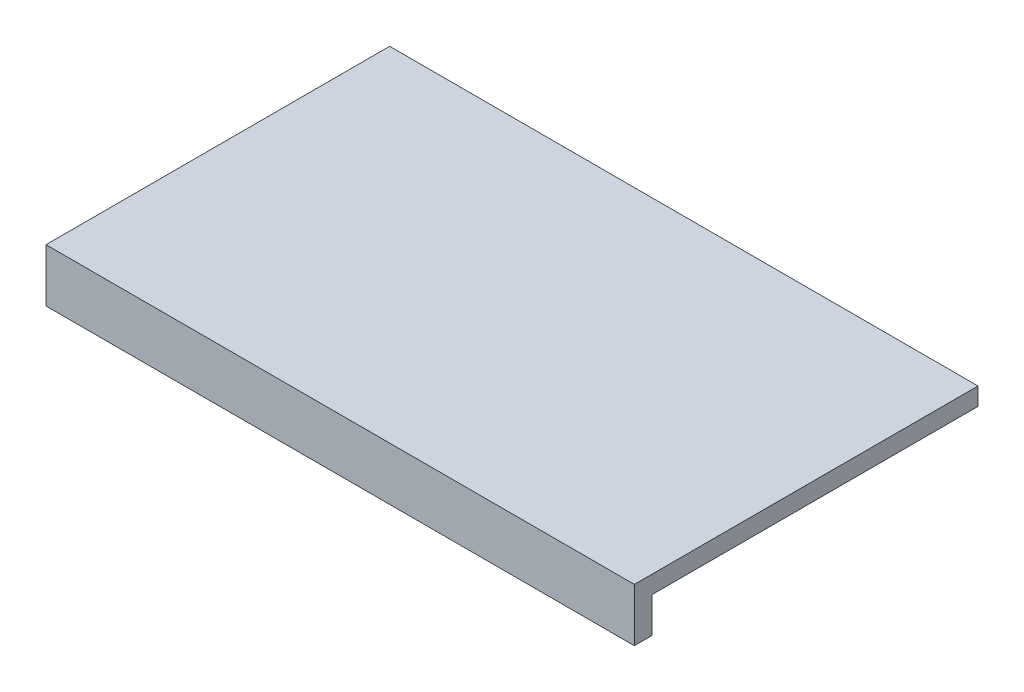
ISO-10303-21;
HEADER;
FILE_DESCRIPTION(('STEP AP214'),'2;1');
FILE_NAME('part.step','',(''),(''),'','','');
FILE_SCHEMA(('AUTOMOTIVE_DESIGN { 1 0 10303 214 1 1 1 1 }'));
ENDSEC;
DATA;
#1=APPLICATION_CONTEXT('core data for automotive mechanical design processes');
#2=APPLICATION_PROTOCOL_DEFINITION('international standard','automotive_design',2000,#1);
#3=PRODUCT_CONTEXT('',#1,'mechanical');
#4=PRODUCT('Part','Part','',(#3));
#5=PRODUCT_RELATED_PRODUCT_CATEGORY('part','',(#4));
#6=PRODUCT_DEFINITION_FORMATION('','',#4);
#7=PRODUCT_DEFINITION_CONTEXT('part definition',#1,'design');
#8=PRODUCT_DEFINITION('design','',#6,#7);
#9=PRODUCT_DEFINITION_SHAPE('','',#8);
#10=(LENGTH_UNIT() NAMED_UNIT(*) SI_UNIT(.MILLI.,.METRE.));
#11=(NAMED_UNIT(*) PLANE_ANGLE_UNIT() SI_UNIT($,.RADIAN.));
#12=(NAMED_UNIT(*) SI_UNIT($,.STERADIAN.) SOLID_ANGLE_UNIT());
#13=UNCERTAINTY_MEASURE_WITH_UNIT(LENGTH_MEASURE(1.E-05),#10,'distance_accuracy_value','');
#14=(GEOMETRIC_REPRESENTATION_CONTEXT(3) GLOBAL_UNCERTAINTY_ASSIGNED_CONTEXT((#13)) GLOBAL_UNIT_ASSIGNED_CONTEXT((#10,
#11,#12)) REPRESENTATION_CONTEXT('',''));
#15=CARTESIAN_POINT('',(0.,0.,0.));
#16=DIRECTION('',(0.,0.,1.));
#17=DIRECTION('',(1.,0.,0.));
#18=AXIS2_PLACEMENT_3D('',#15,#16,#17);
#19=CARTESIAN_POINT('',(282.5,17.,165.));
#20=DIRECTION('',(-1.,0.,0.));
#21=DIRECTION('',(0.,0.,1.));
#22=AXIS2_PLACEMENT_3D('',#19,#20,#21);
#23=PLANE('',#22);
#24=DIRECTION('',(0.,-1.,0.));
#25=VECTOR('',#24,1.);
#26=CARTESIAN_POINT('',(282.5,17.,165.));
#27=LINE('',#26,#25);
#28=CARTESIAN_POINT('',(282.5,17.,165.));
#29=VERTEX_POINT('',#28);
#30=CARTESIAN_POINT('',(282.5,-34.,165.));
#31=VERTEX_POINT('',#30);
#32=EDGE_CURVE('E127',#29,#31,#27,.T.);
#33=ORIENTED_EDGE('',*,*,#32,.T.);
#34=DIRECTION('',(0.,0.,1.));
#35=VECTOR('',#34,1.);
#36=CARTESIAN_POINT('',(282.5,-34.,165.));
#37=LINE('',#36,#35);
#38=CARTESIAN_POINT('',(282.5,-34.,148.));
#39=VERTEX_POINT('',#38);
#40=EDGE_CURVE('E103',#39,#31,#37,.T.);
#41=ORIENTED_EDGE('',*,*,#40,.F.);
#42=DIRECTION('',(0.,1.,0.));
#43=VECTOR('',#42,1.);
#44=CARTESIAN_POINT('',(282.5,-34.,148.));
#45=LINE('',#44,#43);
#46=CARTESIAN_POINT('',(282.5,0.,148.));
#47=VERTEX_POINT('',#46);
#48=EDGE_CURVE('E99',#39,#47,#45,.T.);
#49=ORIENTED_EDGE('',*,*,#48,.T.);
#50=DIRECTION('',(0.,0.,-1.));
#51=VECTOR('',#50,1.);
#52=CARTESIAN_POINT('',(282.5,0.,165.));
#53=LINE('',#52,#51);
#54=CARTESIAN_POINT('',(282.5,0.,-165.));
#55=VERTEX_POINT('',#54);
#56=EDGE_CURVE('E116',#47,#55,#53,.T.);
#57=ORIENTED_EDGE('',*,*,#56,.T.);
#58=DIRECTION('',(0.,-1.,0.));
#59=VECTOR('',#58,1.);
#60=CARTESIAN_POINT('',(282.5,17.,-165.));
#61=LINE('',#60,#59);
#62=CARTESIAN_POINT('',(282.5,17.,-165.));
#63=VERTEX_POINT('',#62);
#64=EDGE_CURVE('E11',#63,#55,#61,.T.);
#65=ORIENTED_EDGE('',*,*,#64,.F.);
#66=DIRECTION('',(0.,0.,-1.));
#67=VECTOR('',#66,1.);
#68=CARTESIAN_POINT('',(282.5,17.,165.));
#69=LINE('',#68,#67);
#70=EDGE_CURVE('E122',#29,#63,#69,.T.);
#71=ORIENTED_EDGE('',*,*,#70,.F.);
#72=EDGE_LOOP('',(#33,#41,#49,#57,#65,#71));
#73=FACE_BOUND('',#72,.T.);
#74=ADVANCED_FACE('F33',(#73),#23,.F.);
#75=CARTESIAN_POINT('',(-282.5,17.,-165.));
#76=DIRECTION('',(0.,0.,1.));
#77=DIRECTION('',(1.,0.,0.));
#78=AXIS2_PLACEMENT_3D('',#75,#76,#77);
#79=PLANE('',#78);
#80=DIRECTION('',(-1.,0.,0.));
#81=VECTOR('',#80,1.);
#82=CARTESIAN_POINT('',(-282.5,0.,-165.));
#83=LINE('',#82,#81);
#84=CARTESIAN_POINT('',(-282.5,0.,-165.));
#85=VERTEX_POINT('',#84);
#86=EDGE_CURVE('E71',#55,#85,#83,.T.);
#87=ORIENTED_EDGE('',*,*,#86,.T.);
#88=DIRECTION('',(0.,-1.,0.));
#89=VECTOR('',#88,1.);
#90=CARTESIAN_POINT('',(-282.5,17.,-165.));
#91=LINE('',#90,#89);
#92=CARTESIAN_POINT('',(-282.5,17.,-165.));
#93=VERTEX_POINT('',#92);
#94=EDGE_CURVE('E40',#93,#85,#91,.T.);
#95=ORIENTED_EDGE('',*,*,#94,.F.);
#96=DIRECTION('',(-1.,0.,0.));
#97=VECTOR('',#96,1.);
#98=CARTESIAN_POINT('',(-282.5,17.,-165.));
#99=LINE('',#98,#97);
#100=EDGE_CURVE('E76',#63,#93,#99,.T.);
#101=ORIENTED_EDGE('',*,*,#100,.F.);
#102=ORIENTED_EDGE('',*,*,#64,.T.);
#103=EDGE_LOOP('',(#87,#95,#101,#102));
#104=FACE_BOUND('',#103,.T.);
#105=ADVANCED_FACE('F136',(#104),#79,.F.);
#106=CARTESIAN_POINT('',(-282.5,17.,165.));
#107=DIRECTION('',(1.,0.,0.));
#108=DIRECTION('',(0.,0.,-1.));
#109=AXIS2_PLACEMENT_3D('',#106,#107,#108);
#110=PLANE('',#109);
#111=DIRECTION('',(0.,0.,1.));
#112=VECTOR('',#111,1.);
#113=CARTESIAN_POINT('',(-282.5,0.,165.));
#114=LINE('',#113,#112);
#115=CARTESIAN_POINT('',(-282.5,0.,148.));
#116=VERTEX_POINT('',#115);
#117=EDGE_CURVE('E115',#85,#116,#114,.T.);
#118=ORIENTED_EDGE('',*,*,#117,.T.);
#119=DIRECTION('',(0.,1.,0.));
#120=VECTOR('',#119,1.);
#121=CARTESIAN_POINT('',(-282.5,-34.,148.));
#122=LINE('',#121,#120);
#123=CARTESIAN_POINT('',(-282.5,-34.,148.));
#124=VERTEX_POINT('',#123);
#125=EDGE_CURVE('E97',#124,#116,#122,.T.);
#126=ORIENTED_EDGE('',*,*,#125,.F.);
#127=DIRECTION('',(0.,0.,-1.));
#128=VECTOR('',#127,1.);
#129=CARTESIAN_POINT('',(-282.5,-34.,165.));
#130=LINE('',#129,#128);
#131=CARTESIAN_POINT('',(-282.5,-34.,165.));
#132=VERTEX_POINT('',#131);
#133=EDGE_CURVE('E104',#132,#124,#130,.T.);
#134=ORIENTED_EDGE('',*,*,#133,.F.);
#135=DIRECTION('',(0.,-1.,0.));
#136=VECTOR('',#135,1.);
#137=CARTESIAN_POINT('',(-282.5,17.,165.));
#138=LINE('',#137,#136);
#139=CARTESIAN_POINT('',(-282.5,17.,165.));
#140=VERTEX_POINT('',#139);
#141=EDGE_CURVE('E132',#140,#132,#138,.T.);
#142=ORIENTED_EDGE('',*,*,#141,.F.);
#143=DIRECTION('',(0.,0.,1.));
#144=VECTOR('',#143,1.);
#145=CARTESIAN_POINT('',(-282.5,17.,165.));
#146=LINE('',#145,#144);
#147=EDGE_CURVE('E125',#93,#140,#146,.T.);
#148=ORIENTED_EDGE('',*,*,#147,.F.);
#149=ORIENTED_EDGE('',*,*,#94,.T.);
#150=EDGE_LOOP('',(#118,#126,#134,#142,#148,#149));
#151=FACE_BOUND('',#150,.T.);
#152=ADVANCED_FACE('F114',(#151),#110,.F.);
#153=CARTESIAN_POINT('',(-282.5,17.,165.));
#154=DIRECTION('',(0.,0.,-1.));
#155=DIRECTION('',(-1.,0.,0.));
#156=AXIS2_PLACEMENT_3D('',#153,#154,#155);
#157=PLANE('',#156);
#158=ORIENTED_EDGE('',*,*,#141,.T.);
#159=DIRECTION('',(-1.,0.,0.));
#160=VECTOR('',#159,1.);
#161=CARTESIAN_POINT('',(-282.5,-34.,165.));
#162=LINE('',#161,#160);
#163=EDGE_CURVE('E110',#31,#132,#162,.T.);
#164=ORIENTED_EDGE('',*,*,#163,.F.);
#165=ORIENTED_EDGE('',*,*,#32,.F.);
#166=DIRECTION('',(1.,0.,0.));
#167=VECTOR('',#166,1.);
#168=CARTESIAN_POINT('',(-282.5,17.,165.));
#169=LINE('',#168,#167);
#170=EDGE_CURVE('E56',#140,#29,#169,.T.);
#171=ORIENTED_EDGE('',*,*,#170,.F.);
#172=EDGE_LOOP('',(#158,#164,#165,#171));
#173=FACE_BOUND('',#172,.T.);
#174=ADVANCED_FACE('F142',(#173),#157,.F.);
#175=CARTESIAN_POINT('',(0.,17.,0.));
#176=DIRECTION('',(0.,-1.,0.));
#177=DIRECTION('',(0.,0.,-1.));
#178=AXIS2_PLACEMENT_3D('',#175,#176,#177);
#179=PLANE('',#178);
#180=ORIENTED_EDGE('',*,*,#70,.T.);
#181=ORIENTED_EDGE('',*,*,#100,.T.);
#182=ORIENTED_EDGE('',*,*,#147,.T.);
#183=ORIENTED_EDGE('',*,*,#170,.T.);
#184=EDGE_LOOP('',(#180,#181,#182,#183));
#185=FACE_BOUND('',#184,.T.);
#186=ADVANCED_FACE('F144',(#185),#179,.F.);
#187=CARTESIAN_POINT('',(0.,0.,0.));
#188=DIRECTION('',(0.,-1.,0.));
#189=DIRECTION('',(0.,0.,-1.));
#190=AXIS2_PLACEMENT_3D('',#187,#188,#189);
#191=PLANE('',#190);
#192=DIRECTION('',(1.,0.,0.));
#193=VECTOR('',#192,1.);
#194=CARTESIAN_POINT('',(-282.5,0.,148.));
#195=LINE('',#194,#193);
#196=EDGE_CURVE('E47',#116,#47,#195,.T.);
#197=ORIENTED_EDGE('',*,*,#196,.F.);
#198=ORIENTED_EDGE('',*,*,#117,.F.);
#199=ORIENTED_EDGE('',*,*,#86,.F.);
#200=ORIENTED_EDGE('',*,*,#56,.F.);
#201=EDGE_LOOP('',(#197,#198,#199,#200));
#202=FACE_BOUND('',#201,.T.);
#203=ADVANCED_FACE('F134',(#202),#191,.T.);
#204=CARTESIAN_POINT('',(-282.5,-34.,148.));
#205=DIRECTION('',(0.,0.,1.));
#206=DIRECTION('',(1.,0.,0.));
#207=AXIS2_PLACEMENT_3D('',#204,#205,#206);
#208=PLANE('',#207);
#209=ORIENTED_EDGE('',*,*,#196,.T.);
#210=ORIENTED_EDGE('',*,*,#48,.F.);
#211=DIRECTION('',(1.,0.,0.));
#212=VECTOR('',#211,1.);
#213=CARTESIAN_POINT('',(-282.5,-34.,148.));
#214=LINE('',#213,#212);
#215=EDGE_CURVE('E93',#124,#39,#214,.T.);
#216=ORIENTED_EDGE('',*,*,#215,.F.);
#217=ORIENTED_EDGE('',*,*,#125,.T.);
#218=EDGE_LOOP('',(#209,#210,#216,#217));
#219=FACE_BOUND('',#218,.T.);
#220=ADVANCED_FACE('F95',(#219),#208,.F.);
#221=CARTESIAN_POINT('',(0.,-34.,0.));
#222=DIRECTION('',(0.,-1.,0.));
#223=DIRECTION('',(0.,0.,-1.));
#224=AXIS2_PLACEMENT_3D('',#221,#222,#223);
#225=PLANE('',#224);
#226=ORIENTED_EDGE('',*,*,#133,.T.);
#227=ORIENTED_EDGE('',*,*,#215,.T.);
#228=ORIENTED_EDGE('',*,*,#40,.T.);
#229=ORIENTED_EDGE('',*,*,#163,.T.);
#230=EDGE_LOOP('',(#226,#227,#228,#229));
#231=FACE_BOUND('',#230,.T.);
#232=ADVANCED_FACE('F108',(#231),#225,.T.);
#233=CLOSED_SHELL('',(#74,#105,#152,#174,#186,#203,#220,#232));
#234=MANIFOLD_SOLID_BREP('B2',#233);
#235=ADVANCED_BREP_SHAPE_REPRESENTATION('',(#18,#234),#14);
#236=SHAPE_DEFINITION_REPRESENTATION(#9,#235);
ENDSEC;
END-ISO-10303-21;
